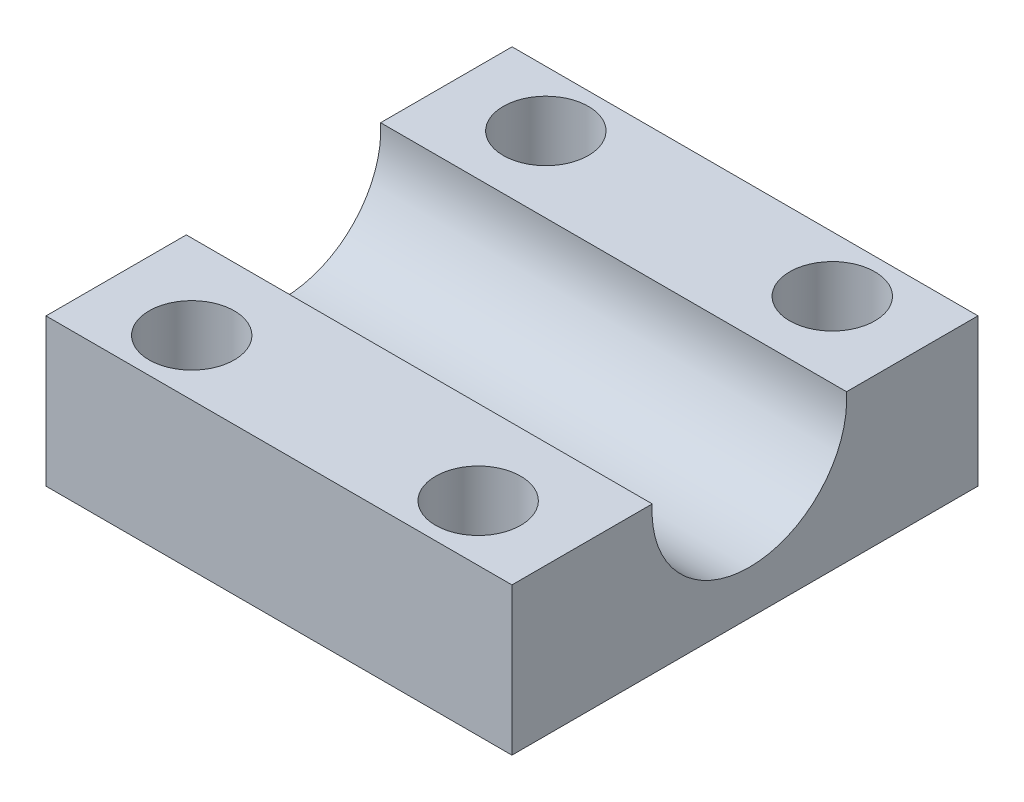
ISO-10303-21;
HEADER;
FILE_DESCRIPTION(('STEP AP214'),'2;1');
FILE_NAME('part.step','',(''),(''),'','','');
FILE_SCHEMA(('AUTOMOTIVE_DESIGN { 1 0 10303 214 1 1 1 1 }'));
ENDSEC;
DATA;
#1=APPLICATION_CONTEXT('core data for automotive mechanical design processes');
#2=APPLICATION_PROTOCOL_DEFINITION('international standard','automotive_design',2000,#1);
#3=PRODUCT_CONTEXT('',#1,'mechanical');
#4=PRODUCT('Part','Part','',(#3));
#5=PRODUCT_RELATED_PRODUCT_CATEGORY('part','',(#4));
#6=PRODUCT_DEFINITION_FORMATION('','',#4);
#7=PRODUCT_DEFINITION_CONTEXT('part definition',#1,'design');
#8=PRODUCT_DEFINITION('design','',#6,#7);
#9=PRODUCT_DEFINITION_SHAPE('','',#8);
#10=(LENGTH_UNIT() NAMED_UNIT(*) SI_UNIT(.MILLI.,.METRE.));
#11=(NAMED_UNIT(*) PLANE_ANGLE_UNIT() SI_UNIT($,.RADIAN.));
#12=(NAMED_UNIT(*) SI_UNIT($,.STERADIAN.) SOLID_ANGLE_UNIT());
#13=UNCERTAINTY_MEASURE_WITH_UNIT(LENGTH_MEASURE(1.E-05),#10,'distance_accuracy_value','');
#14=(GEOMETRIC_REPRESENTATION_CONTEXT(3) GLOBAL_UNCERTAINTY_ASSIGNED_CONTEXT((#13)) GLOBAL_UNIT_ASSIGNED_CONTEXT((#10,
#11,#12)) REPRESENTATION_CONTEXT('',''));
#15=CARTESIAN_POINT('',(0.,0.,0.));
#16=DIRECTION('',(0.,0.,1.));
#17=DIRECTION('',(1.,0.,0.));
#18=AXIS2_PLACEMENT_3D('',#15,#16,#17);
#19=CARTESIAN_POINT('',(0.,12.12,0.));
#20=DIRECTION('',(0.,1.,0.));
#21=DIRECTION('',(0.,0.,1.));
#22=AXIS2_PLACEMENT_3D('',#19,#20,#21);
#23=PLANE('',#22);
#24=CARTESIAN_POINT('',(-11.77,12.12,14.55));
#25=DIRECTION('',(0.,1.,0.));
#26=DIRECTION('',(0.,0.,1.));
#27=AXIS2_PLACEMENT_3D('',#24,#25,#26);
#28=CIRCLE('',#27,3.49999999999999);
#29=CARTESIAN_POINT('',(-11.77,12.12,18.05));
#30=VERTEX_POINT('',#29);
#31=EDGE_CURVE('E204',#30,#30,#28,.T.);
#32=ORIENTED_EDGE('',*,*,#31,.F.);
#33=EDGE_LOOP('',(#32));
#34=FACE_BOUND('',#33,.T.);
#35=CARTESIAN_POINT('',(11.77,12.12,14.55));
#36=DIRECTION('',(0.,1.,0.));
#37=DIRECTION('',(0.,0.,1.));
#38=AXIS2_PLACEMENT_3D('',#35,#36,#37);
#39=CIRCLE('',#38,3.49999999999999);
#40=CARTESIAN_POINT('',(11.77,12.12,18.05));
#41=VERTEX_POINT('',#40);
#42=EDGE_CURVE('E196',#41,#41,#39,.T.);
#43=ORIENTED_EDGE('',*,*,#42,.F.);
#44=EDGE_LOOP('',(#43));
#45=FACE_BOUND('',#44,.T.);
#46=DIRECTION('',(1.,0.,0.));
#47=VECTOR('',#46,1.);
#48=CARTESIAN_POINT('',(-19.145,12.12,7.62052552667431));
#49=LINE('',#48,#47);
#50=CARTESIAN_POINT('',(-19.145,12.12,7.62052552667431));
#51=VERTEX_POINT('',#50);
#52=CARTESIAN_POINT('',(19.145,12.12,7.62052552667431));
#53=VERTEX_POINT('',#52);
#54=EDGE_CURVE('E109',#51,#53,#49,.T.);
#55=ORIENTED_EDGE('',*,*,#54,.F.);
#56=DIRECTION('',(0.,0.,1.));
#57=VECTOR('',#56,1.);
#58=CARTESIAN_POINT('',(-19.145,12.12,-19.15));
#59=LINE('',#58,#57);
#60=CARTESIAN_POINT('',(-19.145,12.12,19.15));
#61=VERTEX_POINT('',#60);
#62=EDGE_CURVE('E118',#51,#61,#59,.T.);
#63=ORIENTED_EDGE('',*,*,#62,.T.);
#64=DIRECTION('',(1.,0.,0.));
#65=VECTOR('',#64,1.);
#66=CARTESIAN_POINT('',(-19.145,12.12,19.15));
#67=LINE('',#66,#65);
#68=CARTESIAN_POINT('',(19.145,12.12,19.15));
#69=VERTEX_POINT('',#68);
#70=EDGE_CURVE('E67',#61,#69,#67,.T.);
#71=ORIENTED_EDGE('',*,*,#70,.T.);
#72=DIRECTION('',(0.,0.,-1.));
#73=VECTOR('',#72,1.);
#74=CARTESIAN_POINT('',(19.145,12.12,-19.15));
#75=LINE('',#74,#73);
#76=EDGE_CURVE('E147',#69,#53,#75,.T.);
#77=ORIENTED_EDGE('',*,*,#76,.T.);
#78=EDGE_LOOP('',(#55,#63,#71,#77));
#79=FACE_BOUND('',#78,.T.);
#80=ADVANCED_FACE('F43',(#34,#45,#79),#23,.T.);
#81=CARTESIAN_POINT('',(19.145,12.12,-19.15));
#82=DIRECTION('',(-1.,0.,0.));
#83=DIRECTION('',(0.,0.,1.));
#84=AXIS2_PLACEMENT_3D('',#81,#82,#83);
#85=PLANE('',#84);
#86=CARTESIAN_POINT('',(19.145,12.12,-8.348193895997));
#87=VERTEX_POINT('',#86);
#88=CARTESIAN_POINT('',(19.145,12.12,-19.15));
#89=VERTEX_POINT('',#88);
#90=EDGE_CURVE('E95',#87,#89,#75,.T.);
#91=ORIENTED_EDGE('',*,*,#90,.F.);
#92=CARTESIAN_POINT('',(19.145,11.62,-0.363834184661345));
#93=DIRECTION('',(1.,0.,0.));
#94=DIRECTION('',(0.,0.,-1.));
#95=AXIS2_PLACEMENT_3D('',#92,#93,#94);
#96=CIRCLE('',#95,8.);
#97=EDGE_CURVE('E58',#53,#87,#96,.T.);
#98=ORIENTED_EDGE('',*,*,#97,.F.);
#99=ORIENTED_EDGE('',*,*,#76,.F.);
#100=DIRECTION('',(0.,-1.,0.));
#101=VECTOR('',#100,1.);
#102=CARTESIAN_POINT('',(19.145,12.12,19.15));
#103=LINE('',#102,#101);
#104=CARTESIAN_POINT('',(19.145,0.,19.15));
#105=VERTEX_POINT('',#104);
#106=EDGE_CURVE('E124',#69,#105,#103,.T.);
#107=ORIENTED_EDGE('',*,*,#106,.T.);
#108=DIRECTION('',(0.,0.,-1.));
#109=VECTOR('',#108,1.);
#110=CARTESIAN_POINT('',(19.145,0.,-19.15));
#111=LINE('',#110,#109);
#112=CARTESIAN_POINT('',(19.145,0.,-19.15));
#113=VERTEX_POINT('',#112);
#114=EDGE_CURVE('E129',#105,#113,#111,.T.);
#115=ORIENTED_EDGE('',*,*,#114,.T.);
#116=DIRECTION('',(0.,-1.,0.));
#117=VECTOR('',#116,1.);
#118=CARTESIAN_POINT('',(19.145,12.12,-19.15));
#119=LINE('',#118,#117);
#120=EDGE_CURVE('E11',#89,#113,#119,.T.);
#121=ORIENTED_EDGE('',*,*,#120,.F.);
#122=EDGE_LOOP('',(#91,#98,#99,#107,#115,#121));
#123=FACE_BOUND('',#122,.T.);
#124=ADVANCED_FACE('F45',(#123),#85,.F.);
#125=CARTESIAN_POINT('',(-19.145,12.12,-19.15));
#126=DIRECTION('',(0.,0.,1.));
#127=DIRECTION('',(1.,0.,0.));
#128=AXIS2_PLACEMENT_3D('',#125,#126,#127);
#129=PLANE('',#128);
#130=DIRECTION('',(-1.,0.,0.));
#131=VECTOR('',#130,1.);
#132=CARTESIAN_POINT('',(-19.145,0.,-19.15));
#133=LINE('',#132,#131);
#134=CARTESIAN_POINT('',(-19.145,0.,-19.15));
#135=VERTEX_POINT('',#134);
#136=EDGE_CURVE('E132',#113,#135,#133,.T.);
#137=ORIENTED_EDGE('',*,*,#136,.T.);
#138=DIRECTION('',(0.,-1.,0.));
#139=VECTOR('',#138,1.);
#140=CARTESIAN_POINT('',(-19.145,12.12,-19.15));
#141=LINE('',#140,#139);
#142=CARTESIAN_POINT('',(-19.145,12.12,-19.15));
#143=VERTEX_POINT('',#142);
#144=EDGE_CURVE('E51',#143,#135,#141,.T.);
#145=ORIENTED_EDGE('',*,*,#144,.F.);
#146=DIRECTION('',(-1.,0.,0.));
#147=VECTOR('',#146,1.);
#148=CARTESIAN_POINT('',(-19.145,12.12,-19.15));
#149=LINE('',#148,#147);
#150=EDGE_CURVE('E121',#89,#143,#149,.T.);
#151=ORIENTED_EDGE('',*,*,#150,.F.);
#152=ORIENTED_EDGE('',*,*,#120,.T.);
#153=EDGE_LOOP('',(#137,#145,#151,#152));
#154=FACE_BOUND('',#153,.T.);
#155=ADVANCED_FACE('F159',(#154),#129,.F.);
#156=CARTESIAN_POINT('',(-19.145,12.12,-19.15));
#157=DIRECTION('',(1.,0.,0.));
#158=DIRECTION('',(0.,0.,-1.));
#159=AXIS2_PLACEMENT_3D('',#156,#157,#158);
#160=PLANE('',#159);
#161=ORIENTED_EDGE('',*,*,#62,.F.);
#162=CARTESIAN_POINT('',(-19.145,11.62,-0.363834184661345));
#163=DIRECTION('',(1.,0.,0.));
#164=DIRECTION('',(0.,0.,-1.));
#165=AXIS2_PLACEMENT_3D('',#162,#163,#164);
#166=CIRCLE('',#165,8.);
#167=CARTESIAN_POINT('',(-19.145,12.12,-8.348193895997));
#168=VERTEX_POINT('',#167);
#169=EDGE_CURVE('E106',#51,#168,#166,.T.);
#170=ORIENTED_EDGE('',*,*,#169,.T.);
#171=EDGE_CURVE('E116',#143,#168,#59,.T.);
#172=ORIENTED_EDGE('',*,*,#171,.F.);
#173=ORIENTED_EDGE('',*,*,#144,.T.);
#174=DIRECTION('',(0.,0.,1.));
#175=VECTOR('',#174,1.);
#176=CARTESIAN_POINT('',(-19.145,0.,-19.15));
#177=LINE('',#176,#175);
#178=CARTESIAN_POINT('',(-19.145,0.,19.15));
#179=VERTEX_POINT('',#178);
#180=EDGE_CURVE('E134',#135,#179,#177,.T.);
#181=ORIENTED_EDGE('',*,*,#180,.T.);
#182=DIRECTION('',(0.,-1.,0.));
#183=VECTOR('',#182,1.);
#184=CARTESIAN_POINT('',(-19.145,12.12,19.15));
#185=LINE('',#184,#183);
#186=EDGE_CURVE('E138',#61,#179,#185,.T.);
#187=ORIENTED_EDGE('',*,*,#186,.F.);
#188=EDGE_LOOP('',(#161,#170,#172,#173,#181,#187));
#189=FACE_BOUND('',#188,.T.);
#190=ADVANCED_FACE('F114',(#189),#160,.F.);
#191=CARTESIAN_POINT('',(-19.145,12.12,19.15));
#192=DIRECTION('',(0.,0.,-1.));
#193=DIRECTION('',(-1.,0.,0.));
#194=AXIS2_PLACEMENT_3D('',#191,#192,#193);
#195=PLANE('',#194);
#196=DIRECTION('',(1.,0.,0.));
#197=VECTOR('',#196,1.);
#198=CARTESIAN_POINT('',(-19.145,0.,19.15));
#199=LINE('',#198,#197);
#200=EDGE_CURVE('E88',#179,#105,#199,.T.);
#201=ORIENTED_EDGE('',*,*,#200,.T.);
#202=ORIENTED_EDGE('',*,*,#106,.F.);
#203=ORIENTED_EDGE('',*,*,#70,.F.);
#204=ORIENTED_EDGE('',*,*,#186,.T.);
#205=EDGE_LOOP('',(#201,#202,#203,#204));
#206=FACE_BOUND('',#205,.T.);
#207=ADVANCED_FACE('F148',(#206),#195,.F.);
#208=CARTESIAN_POINT('',(-11.77,12.12,-14.55));
#209=DIRECTION('',(0.,1.,0.));
#210=DIRECTION('',(0.,0.,1.));
#211=AXIS2_PLACEMENT_3D('',#208,#209,#210);
#212=CIRCLE('',#211,3.49999999999999);
#213=CARTESIAN_POINT('',(-11.77,12.12,-11.05));
#214=VERTEX_POINT('',#213);
#215=EDGE_CURVE('E212',#214,#214,#212,.T.);
#216=ORIENTED_EDGE('',*,*,#215,.F.);
#217=EDGE_LOOP('',(#216));
#218=FACE_BOUND('',#217,.T.);
#219=CARTESIAN_POINT('',(11.77,12.12,-14.55));
#220=DIRECTION('',(0.,1.,0.));
#221=DIRECTION('',(0.,0.,1.));
#222=AXIS2_PLACEMENT_3D('',#219,#220,#221);
#223=CIRCLE('',#222,3.49999999999999);
#224=CARTESIAN_POINT('',(11.77,12.12,-11.05));
#225=VERTEX_POINT('',#224);
#226=EDGE_CURVE('E208',#225,#225,#223,.T.);
#227=ORIENTED_EDGE('',*,*,#226,.F.);
#228=EDGE_LOOP('',(#227));
#229=FACE_BOUND('',#228,.T.);
#230=DIRECTION('',(1.,0.,0.));
#231=VECTOR('',#230,1.);
#232=CARTESIAN_POINT('',(-19.145,12.12,-8.348193895997));
#233=LINE('',#232,#231);
#234=EDGE_CURVE('E103',#168,#87,#233,.T.);
#235=ORIENTED_EDGE('',*,*,#234,.T.);
#236=ORIENTED_EDGE('',*,*,#90,.T.);
#237=ORIENTED_EDGE('',*,*,#150,.T.);
#238=ORIENTED_EDGE('',*,*,#171,.T.);
#239=EDGE_LOOP('',(#235,#236,#237,#238));
#240=FACE_BOUND('',#239,.T.);
#241=ADVANCED_FACE('F120',(#218,#229,#240),#23,.T.);
#242=CARTESIAN_POINT('',(0.,0.,0.));
#243=DIRECTION('',(0.,1.,0.));
#244=DIRECTION('',(0.,0.,1.));
#245=AXIS2_PLACEMENT_3D('',#242,#243,#244);
#246=PLANE('',#245);
#247=CARTESIAN_POINT('',(-11.77,0.,-14.55));
#248=DIRECTION('',(0.,1.,0.));
#249=DIRECTION('',(0.,0.,1.));
#250=AXIS2_PLACEMENT_3D('',#247,#248,#249);
#251=CIRCLE('',#250,3.49999999999999);
#252=CARTESIAN_POINT('',(-11.77,0.,-11.05));
#253=VERTEX_POINT('',#252);
#254=EDGE_CURVE('E183',#253,#253,#251,.T.);
#255=ORIENTED_EDGE('',*,*,#254,.T.);
#256=EDGE_LOOP('',(#255));
#257=FACE_BOUND('',#256,.T.);
#258=CARTESIAN_POINT('',(11.77,0.,-14.55));
#259=DIRECTION('',(0.,1.,0.));
#260=DIRECTION('',(0.,0.,1.));
#261=AXIS2_PLACEMENT_3D('',#258,#259,#260);
#262=CIRCLE('',#261,3.49999999999999);
#263=CARTESIAN_POINT('',(11.77,0.,-11.05));
#264=VERTEX_POINT('',#263);
#265=EDGE_CURVE('E187',#264,#264,#262,.T.);
#266=ORIENTED_EDGE('',*,*,#265,.T.);
#267=EDGE_LOOP('',(#266));
#268=FACE_BOUND('',#267,.T.);
#269=CARTESIAN_POINT('',(-11.77,0.,14.55));
#270=DIRECTION('',(0.,1.,0.));
#271=DIRECTION('',(0.,0.,1.));
#272=AXIS2_PLACEMENT_3D('',#269,#270,#271);
#273=CIRCLE('',#272,3.49999999999999);
#274=CARTESIAN_POINT('',(-11.77,0.,18.05));
#275=VERTEX_POINT('',#274);
#276=EDGE_CURVE('E191',#275,#275,#273,.T.);
#277=ORIENTED_EDGE('',*,*,#276,.T.);
#278=EDGE_LOOP('',(#277));
#279=FACE_BOUND('',#278,.T.);
#280=CARTESIAN_POINT('',(11.77,0.,14.55));
#281=DIRECTION('',(0.,1.,0.));
#282=DIRECTION('',(0.,0.,1.));
#283=AXIS2_PLACEMENT_3D('',#280,#281,#282);
#284=CIRCLE('',#283,3.49999999999999);
#285=CARTESIAN_POINT('',(11.77,0.,18.05));
#286=VERTEX_POINT('',#285);
#287=EDGE_CURVE('E194',#286,#286,#284,.T.);
#288=ORIENTED_EDGE('',*,*,#287,.T.);
#289=EDGE_LOOP('',(#288));
#290=FACE_BOUND('',#289,.T.);
#291=ORIENTED_EDGE('',*,*,#114,.F.);
#292=ORIENTED_EDGE('',*,*,#200,.F.);
#293=ORIENTED_EDGE('',*,*,#180,.F.);
#294=ORIENTED_EDGE('',*,*,#136,.F.);
#295=EDGE_LOOP('',(#291,#292,#293,#294));
#296=FACE_BOUND('',#295,.T.);
#297=ADVANCED_FACE('F143',(#257,#268,#279,#290,#296),#246,.F.);
#298=CARTESIAN_POINT('',(-19.145,11.62,-0.363834184661345));
#299=DIRECTION('',(1.,0.,0.));
#300=DIRECTION('',(0.,0.,-1.));
#301=AXIS2_PLACEMENT_3D('',#298,#299,#300);
#302=CYLINDRICAL_SURFACE('',#301,8.);
#303=ORIENTED_EDGE('',*,*,#97,.T.);
#304=ORIENTED_EDGE('',*,*,#234,.F.);
#305=ORIENTED_EDGE('',*,*,#169,.F.);
#306=ORIENTED_EDGE('',*,*,#54,.T.);
#307=EDGE_LOOP('',(#303,#304,#305,#306));
#308=FACE_BOUND('',#307,.T.);
#309=ADVANCED_FACE('F105',(#308),#302,.F.);
#310=CARTESIAN_POINT('',(11.77,12.12,14.55));
#311=DIRECTION('',(0.,1.,0.));
#312=DIRECTION('',(0.,0.,1.));
#313=AXIS2_PLACEMENT_3D('',#310,#311,#312);
#314=CYLINDRICAL_SURFACE('',#313,3.49999999999999);
#315=ORIENTED_EDGE('',*,*,#287,.F.);
#316=EDGE_LOOP('',(#315));
#317=FACE_BOUND('',#316,.T.);
#318=ORIENTED_EDGE('',*,*,#42,.T.);
#319=EDGE_LOOP('',(#318));
#320=FACE_BOUND('',#319,.T.);
#321=ADVANCED_FACE('F179',(#317,#320),#314,.F.);
#322=CARTESIAN_POINT('',(-11.77,12.12,14.55));
#323=DIRECTION('',(0.,1.,0.));
#324=DIRECTION('',(0.,0.,1.));
#325=AXIS2_PLACEMENT_3D('',#322,#323,#324);
#326=CYLINDRICAL_SURFACE('',#325,3.49999999999999);
#327=ORIENTED_EDGE('',*,*,#276,.F.);
#328=EDGE_LOOP('',(#327));
#329=FACE_BOUND('',#328,.T.);
#330=ORIENTED_EDGE('',*,*,#31,.T.);
#331=EDGE_LOOP('',(#330));
#332=FACE_BOUND('',#331,.T.);
#333=ADVANCED_FACE('F222',(#329,#332),#326,.F.);
#334=CARTESIAN_POINT('',(11.77,12.12,-14.55));
#335=DIRECTION('',(0.,1.,0.));
#336=DIRECTION('',(0.,0.,1.));
#337=AXIS2_PLACEMENT_3D('',#334,#335,#336);
#338=CYLINDRICAL_SURFACE('',#337,3.49999999999999);
#339=ORIENTED_EDGE('',*,*,#265,.F.);
#340=EDGE_LOOP('',(#339));
#341=FACE_BOUND('',#340,.T.);
#342=ORIENTED_EDGE('',*,*,#226,.T.);
#343=EDGE_LOOP('',(#342));
#344=FACE_BOUND('',#343,.T.);
#345=ADVANCED_FACE('F220',(#341,#344),#338,.F.);
#346=CARTESIAN_POINT('',(-11.77,12.12,-14.55));
#347=DIRECTION('',(0.,1.,0.));
#348=DIRECTION('',(0.,0.,1.));
#349=AXIS2_PLACEMENT_3D('',#346,#347,#348);
#350=CYLINDRICAL_SURFACE('',#349,3.49999999999999);
#351=ORIENTED_EDGE('',*,*,#254,.F.);
#352=EDGE_LOOP('',(#351));
#353=FACE_BOUND('',#352,.T.);
#354=ORIENTED_EDGE('',*,*,#215,.T.);
#355=EDGE_LOOP('',(#354));
#356=FACE_BOUND('',#355,.T.);
#357=ADVANCED_FACE('F216',(#353,#356),#350,.F.);
#358=CLOSED_SHELL('',(#80,#124,#155,#190,#207,#241,#297,#309,#321,#333,#345,#357));
#359=MANIFOLD_SOLID_BREP('B2',#358);
#360=ADVANCED_BREP_SHAPE_REPRESENTATION('',(#18,#359),#14);
#361=SHAPE_DEFINITION_REPRESENTATION(#9,#360);
ENDSEC;
END-ISO-10303-21;
